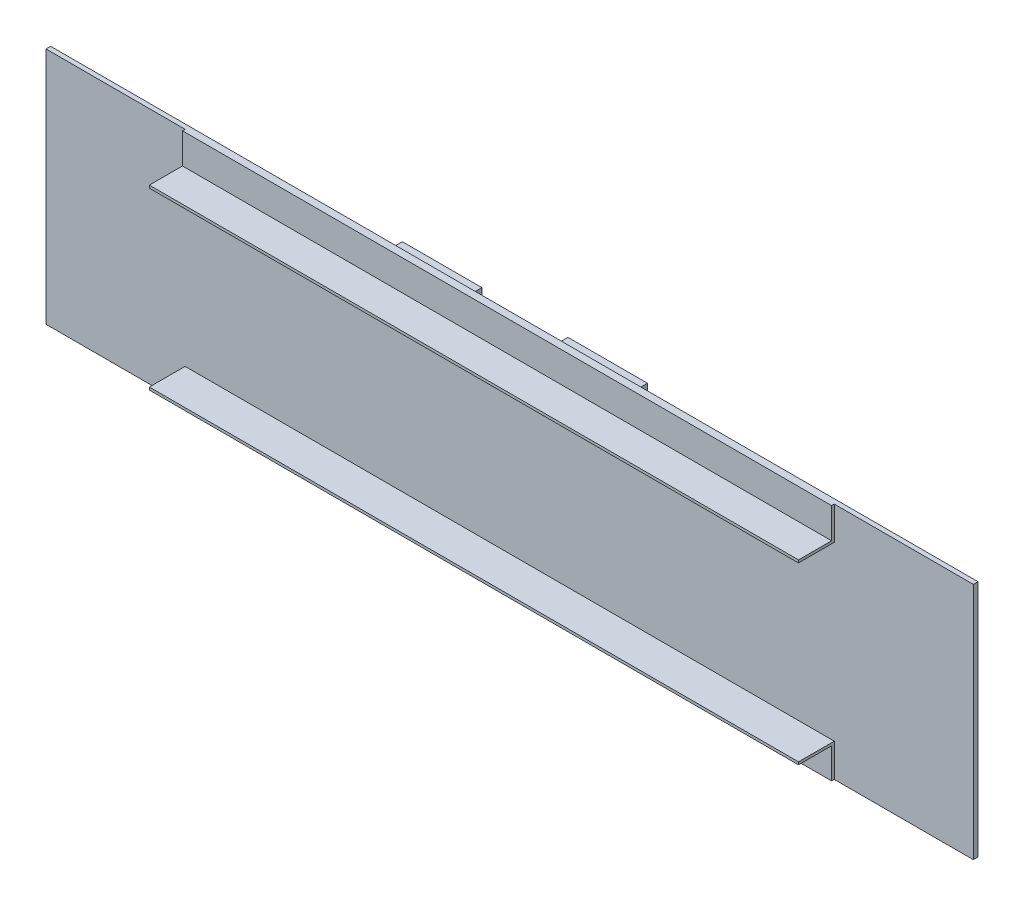
ISO-10303-21;
HEADER;
FILE_DESCRIPTION(('STEP AP214'),'2;1');
FILE_NAME('part.step','',(''),(''),'','','');
FILE_SCHEMA(('AUTOMOTIVE_DESIGN { 1 0 10303 214 1 1 1 1 }'));
ENDSEC;
DATA;
#1=APPLICATION_CONTEXT('core data for automotive mechanical design processes');
#2=APPLICATION_PROTOCOL_DEFINITION('international standard','automotive_design',2000,#1);
#3=PRODUCT_CONTEXT('',#1,'mechanical');
#4=PRODUCT('Part','Part','',(#3));
#5=PRODUCT_RELATED_PRODUCT_CATEGORY('part','',(#4));
#6=PRODUCT_DEFINITION_FORMATION('','',#4);
#7=PRODUCT_DEFINITION_CONTEXT('part definition',#1,'design');
#8=PRODUCT_DEFINITION('design','',#6,#7);
#9=PRODUCT_DEFINITION_SHAPE('','',#8);
#10=(LENGTH_UNIT() NAMED_UNIT(*) SI_UNIT(.MILLI.,.METRE.));
#11=(NAMED_UNIT(*) PLANE_ANGLE_UNIT() SI_UNIT($,.RADIAN.));
#12=(NAMED_UNIT(*) SI_UNIT($,.STERADIAN.) SOLID_ANGLE_UNIT());
#13=UNCERTAINTY_MEASURE_WITH_UNIT(LENGTH_MEASURE(1.E-05),#10,'distance_accuracy_value','');
#14=(GEOMETRIC_REPRESENTATION_CONTEXT(3) GLOBAL_UNCERTAINTY_ASSIGNED_CONTEXT((#13)) GLOBAL_UNIT_ASSIGNED_CONTEXT((#10,
#11,#12)) REPRESENTATION_CONTEXT('',''));
#15=CARTESIAN_POINT('',(0.,0.,0.));
#16=DIRECTION('',(0.,0.,1.));
#17=DIRECTION('',(1.,0.,0.));
#18=AXIS2_PLACEMENT_3D('',#15,#16,#17);
#19=CARTESIAN_POINT('',(-980.000000000001,260.,22.));
#20=DIRECTION('',(0.,0.,1.));
#21=DIRECTION('',(1.,0.,0.));
#22=AXIS2_PLACEMENT_3D('',#19,#20,#21);
#23=PLANE('',#22);
#24=DIRECTION('',(0.,-1.,0.));
#25=VECTOR('',#24,1.);
#26=CARTESIAN_POINT('',(-980.000000000001,360.,22.));
#27=LINE('',#26,#25);
#28=CARTESIAN_POINT('',(-980.000000000001,360.,22.));
#29=VERTEX_POINT('',#28);
#30=CARTESIAN_POINT('',(-980.000000000001,268.,22.));
#31=VERTEX_POINT('',#30);
#32=EDGE_CURVE('E447',#29,#31,#27,.T.);
#33=ORIENTED_EDGE('',*,*,#32,.T.);
#34=DIRECTION('',(-1.,0.,0.));
#35=VECTOR('',#34,1.);
#36=CARTESIAN_POINT('',(-980.000000000001,268.,22.));
#37=LINE('',#36,#35);
#38=CARTESIAN_POINT('',(980.000000000001,268.,22.));
#39=VERTEX_POINT('',#38);
#40=EDGE_CURVE('E453',#39,#31,#37,.T.);
#41=ORIENTED_EDGE('',*,*,#40,.F.);
#42=DIRECTION('',(0.,-1.,0.));
#43=VECTOR('',#42,1.);
#44=CARTESIAN_POINT('',(980.000000000001,360.,22.));
#45=LINE('',#44,#43);
#46=CARTESIAN_POINT('',(980.000000000001,360.,22.));
#47=VERTEX_POINT('',#46);
#48=EDGE_CURVE('E385',#47,#39,#45,.T.);
#49=ORIENTED_EDGE('',*,*,#48,.F.);
#50=DIRECTION('',(-1.,0.,0.));
#51=VECTOR('',#50,1.);
#52=CARTESIAN_POINT('',(-980.000000000001,360.,22.));
#53=LINE('',#52,#51);
#54=EDGE_CURVE('E451',#47,#29,#53,.T.);
#55=ORIENTED_EDGE('',*,*,#54,.T.);
#56=EDGE_LOOP('',(#33,#41,#49,#55));
#57=FACE_BOUND('',#56,.T.);
#58=ADVANCED_FACE('F36',(#57),#23,.T.);
#59=CARTESIAN_POINT('',(370.000000000001,348.,-32.));
#60=DIRECTION('',(0.,0.,-1.));
#61=DIRECTION('',(1.,0.,0.));
#62=AXIS2_PLACEMENT_3D('',#59,#60,#61);
#63=PLANE('',#62);
#64=DIRECTION('',(0.,-1.,0.));
#65=VECTOR('',#64,1.);
#66=CARTESIAN_POINT('',(370.000000000001,268.,-32.));
#67=LINE('',#66,#65);
#68=CARTESIAN_POINT('',(370.000000000001,348.,-32.));
#69=VERTEX_POINT('',#68);
#70=CARTESIAN_POINT('',(370.000000000001,268.,-32.));
#71=VERTEX_POINT('',#70);
#72=EDGE_CURVE('E247',#69,#71,#67,.T.);
#73=ORIENTED_EDGE('',*,*,#72,.T.);
#74=DIRECTION('',(-1.,0.,0.));
#75=VECTOR('',#74,1.);
#76=CARTESIAN_POINT('',(370.000000000001,268.,-32.));
#77=LINE('',#76,#75);
#78=CARTESIAN_POINT('',(130.000000000001,268.,-32.));
#79=VERTEX_POINT('',#78);
#80=EDGE_CURVE('E262',#71,#79,#77,.T.);
#81=ORIENTED_EDGE('',*,*,#80,.T.);
#82=DIRECTION('',(0.,1.,0.));
#83=VECTOR('',#82,1.);
#84=CARTESIAN_POINT('',(130.000000000001,268.,-32.));
#85=LINE('',#84,#83);
#86=CARTESIAN_POINT('',(130.000000000001,348.,-32.));
#87=VERTEX_POINT('',#86);
#88=EDGE_CURVE('E250',#79,#87,#85,.T.);
#89=ORIENTED_EDGE('',*,*,#88,.T.);
#90=DIRECTION('',(1.,0.,0.));
#91=VECTOR('',#90,1.);
#92=CARTESIAN_POINT('',(370.000000000001,348.,-32.));
#93=LINE('',#92,#91);
#94=EDGE_CURVE('E243',#87,#69,#93,.T.);
#95=ORIENTED_EDGE('',*,*,#94,.T.);
#96=EDGE_LOOP('',(#73,#81,#89,#95));
#97=FACE_BOUND('',#96,.T.);
#98=ADVANCED_FACE('F245',(#97),#63,.T.);
#99=CARTESIAN_POINT('',(1400.,-360.,0.));
#100=DIRECTION('',(0.,0.,1.));
#101=DIRECTION('',(1.,0.,0.));
#102=AXIS2_PLACEMENT_3D('',#99,#100,#101);
#103=PLANE('',#102);
#104=DIRECTION('',(0.,1.,0.));
#105=VECTOR('',#104,1.);
#106=CARTESIAN_POINT('',(-370.000000000001,-360.,0.));
#107=LINE('',#106,#105);
#108=CARTESIAN_POINT('',(-370.000000000001,-348.,0.));
#109=VERTEX_POINT('',#108);
#110=CARTESIAN_POINT('',(-370.000000000001,-268.,0.));
#111=VERTEX_POINT('',#110);
#112=EDGE_CURVE('E334',#109,#111,#107,.T.);
#113=ORIENTED_EDGE('',*,*,#112,.F.);
#114=DIRECTION('',(-1.,0.,0.));
#115=VECTOR('',#114,1.);
#116=CARTESIAN_POINT('',(1400.,-348.,0.));
#117=LINE('',#116,#115);
#118=CARTESIAN_POINT('',(-130.000000000001,-348.,0.));
#119=VERTEX_POINT('',#118);
#120=EDGE_CURVE('E337',#119,#109,#117,.T.);
#121=ORIENTED_EDGE('',*,*,#120,.F.);
#122=DIRECTION('',(0.,-1.,0.));
#123=VECTOR('',#122,1.);
#124=CARTESIAN_POINT('',(-130.000000000001,-360.,0.));
#125=LINE('',#124,#123);
#126=CARTESIAN_POINT('',(-130.000000000001,-268.,0.));
#127=VERTEX_POINT('',#126);
#128=EDGE_CURVE('E323',#127,#119,#125,.T.);
#129=ORIENTED_EDGE('',*,*,#128,.F.);
#130=DIRECTION('',(1.,0.,0.));
#131=VECTOR('',#130,1.);
#132=CARTESIAN_POINT('',(1400.,-268.,0.));
#133=LINE('',#132,#131);
#134=EDGE_CURVE('E340',#111,#127,#133,.T.);
#135=ORIENTED_EDGE('',*,*,#134,.F.);
#136=EDGE_LOOP('',(#113,#121,#129,#135));
#137=FACE_BOUND('',#136,.T.);
#138=DIRECTION('',(-1.,0.,0.));
#139=VECTOR('',#138,1.);
#140=CARTESIAN_POINT('',(1400.,348.,0.));
#141=LINE('',#140,#139);
#142=CARTESIAN_POINT('',(-130.000000000001,348.,0.));
#143=VERTEX_POINT('',#142);
#144=CARTESIAN_POINT('',(-370.000000000001,348.,0.));
#145=VERTEX_POINT('',#144);
#146=EDGE_CURVE('E375',#143,#145,#141,.T.);
#147=ORIENTED_EDGE('',*,*,#146,.T.);
#148=DIRECTION('',(0.,-1.,0.));
#149=VECTOR('',#148,1.);
#150=CARTESIAN_POINT('',(-370.000000000001,-360.,0.));
#151=LINE('',#150,#149);
#152=CARTESIAN_POINT('',(-370.000000000001,268.,0.));
#153=VERTEX_POINT('',#152);
#154=EDGE_CURVE('E369',#145,#153,#151,.T.);
#155=ORIENTED_EDGE('',*,*,#154,.T.);
#156=DIRECTION('',(1.,0.,0.));
#157=VECTOR('',#156,1.);
#158=CARTESIAN_POINT('',(1400.,268.,0.));
#159=LINE('',#158,#157);
#160=CARTESIAN_POINT('',(-130.000000000001,268.,0.));
#161=VERTEX_POINT('',#160);
#162=EDGE_CURVE('E372',#153,#161,#159,.T.);
#163=ORIENTED_EDGE('',*,*,#162,.T.);
#164=DIRECTION('',(0.,1.,0.));
#165=VECTOR('',#164,1.);
#166=CARTESIAN_POINT('',(-130.000000000001,-360.,0.));
#167=LINE('',#166,#165);
#168=EDGE_CURVE('E359',#161,#143,#167,.T.);
#169=ORIENTED_EDGE('',*,*,#168,.T.);
#170=EDGE_LOOP('',(#147,#155,#163,#169));
#171=FACE_BOUND('',#170,.T.);
#172=DIRECTION('',(0.,1.,0.));
#173=VECTOR('',#172,1.);
#174=CARTESIAN_POINT('',(1400.,360.,0.));
#175=LINE('',#174,#173);
#176=CARTESIAN_POINT('',(1400.,-360.,0.));
#177=VERTEX_POINT('',#176);
#178=CARTESIAN_POINT('',(1400.,360.,0.));
#179=VERTEX_POINT('',#178);
#180=EDGE_CURVE('E472',#177,#179,#175,.T.);
#181=ORIENTED_EDGE('',*,*,#180,.F.);
#182=DIRECTION('',(1.,0.,0.));
#183=VECTOR('',#182,1.);
#184=CARTESIAN_POINT('',(-1400.,-360.,0.));
#185=LINE('',#184,#183);
#186=CARTESIAN_POINT('',(-1400.,-360.,0.));
#187=VERTEX_POINT('',#186);
#188=EDGE_CURVE('E477',#187,#177,#185,.T.);
#189=ORIENTED_EDGE('',*,*,#188,.F.);
#190=DIRECTION('',(0.,-1.,0.));
#191=VECTOR('',#190,1.);
#192=CARTESIAN_POINT('',(-1400.,360.,0.));
#193=LINE('',#192,#191);
#194=CARTESIAN_POINT('',(-1400.,360.,0.));
#195=VERTEX_POINT('',#194);
#196=EDGE_CURVE('E490',#195,#187,#193,.T.);
#197=ORIENTED_EDGE('',*,*,#196,.F.);
#198=DIRECTION('',(-1.,0.,0.));
#199=VECTOR('',#198,1.);
#200=CARTESIAN_POINT('',(-1400.,360.,0.));
#201=LINE('',#200,#199);
#202=EDGE_CURVE('E488',#179,#195,#201,.T.);
#203=ORIENTED_EDGE('',*,*,#202,.F.);
#204=EDGE_LOOP('',(#181,#189,#197,#203));
#205=FACE_BOUND('',#204,.T.);
#206=DIRECTION('',(1.,0.,0.));
#207=VECTOR('',#206,1.);
#208=CARTESIAN_POINT('',(1400.,-348.,0.));
#209=LINE('',#208,#207);
#210=CARTESIAN_POINT('',(130.000000000001,-348.,0.));
#211=VERTEX_POINT('',#210);
#212=CARTESIAN_POINT('',(370.000000000001,-348.,0.));
#213=VERTEX_POINT('',#212);
#214=EDGE_CURVE('E11',#211,#213,#209,.T.);
#215=ORIENTED_EDGE('',*,*,#214,.T.);
#216=DIRECTION('',(0.,1.,0.));
#217=VECTOR('',#216,1.);
#218=CARTESIAN_POINT('',(370.000000000001,-360.,0.));
#219=LINE('',#218,#217);
#220=CARTESIAN_POINT('',(370.000000000001,-268.,0.));
#221=VERTEX_POINT('',#220);
#222=EDGE_CURVE('E307',#213,#221,#219,.T.);
#223=ORIENTED_EDGE('',*,*,#222,.T.);
#224=DIRECTION('',(-1.,0.,0.));
#225=VECTOR('',#224,1.);
#226=CARTESIAN_POINT('',(1400.,-268.,0.));
#227=LINE('',#226,#225);
#228=CARTESIAN_POINT('',(130.000000000001,-268.,0.));
#229=VERTEX_POINT('',#228);
#230=EDGE_CURVE('E44',#221,#229,#227,.T.);
#231=ORIENTED_EDGE('',*,*,#230,.T.);
#232=DIRECTION('',(0.,-1.,0.));
#233=VECTOR('',#232,1.);
#234=CARTESIAN_POINT('',(130.000000000001,-360.,0.));
#235=LINE('',#234,#233);
#236=EDGE_CURVE('E297',#229,#211,#235,.T.);
#237=ORIENTED_EDGE('',*,*,#236,.T.);
#238=EDGE_LOOP('',(#215,#223,#231,#237));
#239=FACE_BOUND('',#238,.T.);
#240=DIRECTION('',(0.,-1.,0.));
#241=VECTOR('',#240,1.);
#242=CARTESIAN_POINT('',(370.000000000001,-360.,0.));
#243=LINE('',#242,#241);
#244=CARTESIAN_POINT('',(370.000000000001,348.,0.));
#245=VERTEX_POINT('',#244);
#246=CARTESIAN_POINT('',(370.000000000001,268.,0.));
#247=VERTEX_POINT('',#246);
#248=EDGE_CURVE('E277',#245,#247,#243,.T.);
#249=ORIENTED_EDGE('',*,*,#248,.F.);
#250=DIRECTION('',(1.,0.,0.));
#251=VECTOR('',#250,1.);
#252=CARTESIAN_POINT('',(1400.,348.,0.));
#253=LINE('',#252,#251);
#254=CARTESIAN_POINT('',(130.000000000001,348.,0.));
#255=VERTEX_POINT('',#254);
#256=EDGE_CURVE('E259',#255,#245,#253,.T.);
#257=ORIENTED_EDGE('',*,*,#256,.F.);
#258=DIRECTION('',(0.,1.,0.));
#259=VECTOR('',#258,1.);
#260=CARTESIAN_POINT('',(130.000000000001,-360.,0.));
#261=LINE('',#260,#259);
#262=CARTESIAN_POINT('',(130.000000000001,268.,0.));
#263=VERTEX_POINT('',#262);
#264=EDGE_CURVE('E56',#263,#255,#261,.T.);
#265=ORIENTED_EDGE('',*,*,#264,.F.);
#266=DIRECTION('',(-1.,0.,0.));
#267=VECTOR('',#266,1.);
#268=CARTESIAN_POINT('',(1400.,268.,0.));
#269=LINE('',#268,#267);
#270=EDGE_CURVE('E51',#247,#263,#269,.T.);
#271=ORIENTED_EDGE('',*,*,#270,.F.);
#272=EDGE_LOOP('',(#249,#257,#265,#271));
#273=FACE_BOUND('',#272,.T.);
#274=ADVANCED_FACE('F508',(#137,#171,#205,#239,#273),#103,.F.);
#275=CARTESIAN_POINT('',(-980.000000000001,-260.,22.));
#276=DIRECTION('',(0.,0.,1.));
#277=DIRECTION('',(1.,0.,0.));
#278=AXIS2_PLACEMENT_3D('',#275,#276,#277);
#279=PLANE('',#278);
#280=DIRECTION('',(-1.,0.,0.));
#281=VECTOR('',#280,1.);
#282=CARTESIAN_POINT('',(-980.000000000001,-268.,22.));
#283=LINE('',#282,#281);
#284=CARTESIAN_POINT('',(980.000000000001,-268.,22.));
#285=VERTEX_POINT('',#284);
#286=CARTESIAN_POINT('',(-980.000000000001,-268.,22.));
#287=VERTEX_POINT('',#286);
#288=EDGE_CURVE('E410',#285,#287,#283,.T.);
#289=ORIENTED_EDGE('',*,*,#288,.T.);
#290=DIRECTION('',(0.,1.,0.));
#291=VECTOR('',#290,1.);
#292=CARTESIAN_POINT('',(-980.000000000001,-360.,22.));
#293=LINE('',#292,#291);
#294=CARTESIAN_POINT('',(-980.000000000001,-360.,22.));
#295=VERTEX_POINT('',#294);
#296=EDGE_CURVE('E427',#295,#287,#293,.T.);
#297=ORIENTED_EDGE('',*,*,#296,.F.);
#298=DIRECTION('',(-1.,0.,0.));
#299=VECTOR('',#298,1.);
#300=CARTESIAN_POINT('',(-980.000000000001,-360.,22.));
#301=LINE('',#300,#299);
#302=CARTESIAN_POINT('',(980.000000000001,-360.,22.));
#303=VERTEX_POINT('',#302);
#304=EDGE_CURVE('E529',#303,#295,#301,.T.);
#305=ORIENTED_EDGE('',*,*,#304,.F.);
#306=DIRECTION('',(0.,1.,0.));
#307=VECTOR('',#306,1.);
#308=CARTESIAN_POINT('',(980.000000000001,-360.,22.));
#309=LINE('',#308,#307);
#310=EDGE_CURVE('E401',#303,#285,#309,.T.);
#311=ORIENTED_EDGE('',*,*,#310,.T.);
#312=EDGE_LOOP('',(#289,#297,#305,#311));
#313=FACE_BOUND('',#312,.T.);
#314=ADVANCED_FACE('F527',(#313),#279,.T.);
#315=CARTESIAN_POINT('',(-370.000000000001,-348.,-32.));
#316=DIRECTION('',(0.,0.,-1.));
#317=DIRECTION('',(-1.,0.,0.));
#318=AXIS2_PLACEMENT_3D('',#315,#316,#317);
#319=PLANE('',#318);
#320=DIRECTION('',(0.,1.,0.));
#321=VECTOR('',#320,1.);
#322=CARTESIAN_POINT('',(-370.000000000001,-268.,-32.));
#323=LINE('',#322,#321);
#324=CARTESIAN_POINT('',(-370.000000000001,-348.,-32.));
#325=VERTEX_POINT('',#324);
#326=CARTESIAN_POINT('',(-370.000000000001,-268.,-32.));
#327=VERTEX_POINT('',#326);
#328=EDGE_CURVE('E310',#325,#327,#323,.T.);
#329=ORIENTED_EDGE('',*,*,#328,.T.);
#330=DIRECTION('',(1.,0.,0.));
#331=VECTOR('',#330,1.);
#332=CARTESIAN_POINT('',(-370.000000000001,-268.,-32.));
#333=LINE('',#332,#331);
#334=CARTESIAN_POINT('',(-130.000000000001,-268.,-32.));
#335=VERTEX_POINT('',#334);
#336=EDGE_CURVE('E317',#327,#335,#333,.T.);
#337=ORIENTED_EDGE('',*,*,#336,.T.);
#338=DIRECTION('',(0.,-1.,0.));
#339=VECTOR('',#338,1.);
#340=CARTESIAN_POINT('',(-130.000000000001,-268.,-32.));
#341=LINE('',#340,#339);
#342=CARTESIAN_POINT('',(-130.000000000001,-348.,-32.));
#343=VERTEX_POINT('',#342);
#344=EDGE_CURVE('E315',#335,#343,#341,.T.);
#345=ORIENTED_EDGE('',*,*,#344,.T.);
#346=DIRECTION('',(-1.,0.,0.));
#347=VECTOR('',#346,1.);
#348=CARTESIAN_POINT('',(-370.000000000001,-348.,-32.));
#349=LINE('',#348,#347);
#350=EDGE_CURVE('E313',#343,#325,#349,.T.);
#351=ORIENTED_EDGE('',*,*,#350,.T.);
#352=EDGE_LOOP('',(#329,#337,#345,#351));
#353=FACE_BOUND('',#352,.T.);
#354=ADVANCED_FACE('F593',(#353),#319,.T.);
#355=CARTESIAN_POINT('',(1400.,-360.,14.));
#356=DIRECTION('',(0.,0.,1.));
#357=DIRECTION('',(1.,0.,0.));
#358=AXIS2_PLACEMENT_3D('',#355,#356,#357);
#359=PLANE('',#358);
#360=DIRECTION('',(0.,-1.,0.));
#361=VECTOR('',#360,1.);
#362=CARTESIAN_POINT('',(980.000000000001,360.,14.));
#363=LINE('',#362,#361);
#364=CARTESIAN_POINT('',(980.000000000001,360.,14.));
#365=VERTEX_POINT('',#364);
#366=CARTESIAN_POINT('',(980.000000000001,260.,14.));
#367=VERTEX_POINT('',#366);
#368=EDGE_CURVE('E384',#365,#367,#363,.T.);
#369=ORIENTED_EDGE('',*,*,#368,.T.);
#370=DIRECTION('',(1.,0.,0.));
#371=VECTOR('',#370,1.);
#372=CARTESIAN_POINT('',(-980.000000000001,260.,14.));
#373=LINE('',#372,#371);
#374=CARTESIAN_POINT('',(-980.000000000001,260.,14.));
#375=VERTEX_POINT('',#374);
#376=EDGE_CURVE('E452',#375,#367,#373,.T.);
#377=ORIENTED_EDGE('',*,*,#376,.F.);
#378=DIRECTION('',(0.,-1.,0.));
#379=VECTOR('',#378,1.);
#380=CARTESIAN_POINT('',(-980.000000000001,360.,14.));
#381=LINE('',#380,#379);
#382=CARTESIAN_POINT('',(-980.000000000001,360.,14.));
#383=VERTEX_POINT('',#382);
#384=EDGE_CURVE('E462',#383,#375,#381,.T.);
#385=ORIENTED_EDGE('',*,*,#384,.F.);
#386=DIRECTION('',(-1.,0.,0.));
#387=VECTOR('',#386,1.);
#388=CARTESIAN_POINT('',(-1400.,360.,14.));
#389=LINE('',#388,#387);
#390=CARTESIAN_POINT('',(-1400.,360.,14.));
#391=VERTEX_POINT('',#390);
#392=EDGE_CURVE('E476',#383,#391,#389,.T.);
#393=ORIENTED_EDGE('',*,*,#392,.T.);
#394=DIRECTION('',(0.,-1.,0.));
#395=VECTOR('',#394,1.);
#396=CARTESIAN_POINT('',(-1400.,360.,14.));
#397=LINE('',#396,#395);
#398=CARTESIAN_POINT('',(-1400.,-360.,14.));
#399=VERTEX_POINT('',#398);
#400=EDGE_CURVE('E481',#391,#399,#397,.T.);
#401=ORIENTED_EDGE('',*,*,#400,.T.);
#402=DIRECTION('',(1.,0.,0.));
#403=VECTOR('',#402,1.);
#404=CARTESIAN_POINT('',(-1400.,-360.,14.));
#405=LINE('',#404,#403);
#406=CARTESIAN_POINT('',(-980.000000000001,-360.,14.));
#407=VERTEX_POINT('',#406);
#408=EDGE_CURVE('E484',#399,#407,#405,.T.);
#409=ORIENTED_EDGE('',*,*,#408,.T.);
#410=DIRECTION('',(0.,1.,0.));
#411=VECTOR('',#410,1.);
#412=CARTESIAN_POINT('',(-980.000000000001,-360.,14.));
#413=LINE('',#412,#411);
#414=CARTESIAN_POINT('',(-980.000000000001,-260.,14.));
#415=VERTEX_POINT('',#414);
#416=EDGE_CURVE('E431',#407,#415,#413,.T.);
#417=ORIENTED_EDGE('',*,*,#416,.T.);
#418=DIRECTION('',(1.,0.,0.));
#419=VECTOR('',#418,1.);
#420=CARTESIAN_POINT('',(-980.000000000001,-260.,14.));
#421=LINE('',#420,#419);
#422=CARTESIAN_POINT('',(980.000000000001,-260.,14.));
#423=VERTEX_POINT('',#422);
#424=EDGE_CURVE('E520',#415,#423,#421,.T.);
#425=ORIENTED_EDGE('',*,*,#424,.T.);
#426=DIRECTION('',(0.,1.,0.));
#427=VECTOR('',#426,1.);
#428=CARTESIAN_POINT('',(980.000000000001,-360.,14.));
#429=LINE('',#428,#427);
#430=CARTESIAN_POINT('',(980.000000000001,-360.,14.));
#431=VERTEX_POINT('',#430);
#432=EDGE_CURVE('E400',#431,#423,#429,.T.);
#433=ORIENTED_EDGE('',*,*,#432,.F.);
#434=CARTESIAN_POINT('',(1400.,-360.,14.));
#435=VERTEX_POINT('',#434);
#436=EDGE_CURVE('E483',#431,#435,#405,.T.);
#437=ORIENTED_EDGE('',*,*,#436,.T.);
#438=DIRECTION('',(0.,1.,0.));
#439=VECTOR('',#438,1.);
#440=CARTESIAN_POINT('',(1400.,360.,14.));
#441=LINE('',#440,#439);
#442=CARTESIAN_POINT('',(1400.,360.,14.));
#443=VERTEX_POINT('',#442);
#444=EDGE_CURVE('E473',#435,#443,#441,.T.);
#445=ORIENTED_EDGE('',*,*,#444,.T.);
#446=EDGE_CURVE('E478',#443,#365,#389,.T.);
#447=ORIENTED_EDGE('',*,*,#446,.T.);
#448=EDGE_LOOP('',(#369,#377,#385,#393,#401,#409,#417,#425,#433,#437,#445,#447));
#449=FACE_BOUND('',#448,.T.);
#450=ADVANCED_FACE('F516',(#449),#359,.T.);
#451=CARTESIAN_POINT('',(1400.,360.,14.));
#452=DIRECTION('',(-1.,0.,0.));
#453=DIRECTION('',(0.,0.,1.));
#454=AXIS2_PLACEMENT_3D('',#451,#452,#453);
#455=PLANE('',#454);
#456=ORIENTED_EDGE('',*,*,#180,.T.);
#457=DIRECTION('',(0.,0.,-1.));
#458=VECTOR('',#457,1.);
#459=CARTESIAN_POINT('',(1400.,360.,14.));
#460=LINE('',#459,#458);
#461=EDGE_CURVE('E434',#443,#179,#460,.T.);
#462=ORIENTED_EDGE('',*,*,#461,.F.);
#463=ORIENTED_EDGE('',*,*,#444,.F.);
#464=DIRECTION('',(0.,0.,-1.));
#465=VECTOR('',#464,1.);
#466=CARTESIAN_POINT('',(1400.,-360.,14.));
#467=LINE('',#466,#465);
#468=EDGE_CURVE('E486',#435,#177,#467,.T.);
#469=ORIENTED_EDGE('',*,*,#468,.T.);
#470=EDGE_LOOP('',(#456,#462,#463,#469));
#471=FACE_BOUND('',#470,.T.);
#472=ADVANCED_FACE('F38',(#471),#455,.F.);
#473=CARTESIAN_POINT('',(-1400.,360.,14.));
#474=DIRECTION('',(0.,-1.,0.));
#475=DIRECTION('',(0.,0.,-1.));
#476=AXIS2_PLACEMENT_3D('',#473,#474,#475);
#477=PLANE('',#476);
#478=DIRECTION('',(0.,0.,-1.));
#479=VECTOR('',#478,1.);
#480=CARTESIAN_POINT('',(980.000000000001,360.,22.));
#481=LINE('',#480,#479);
#482=EDGE_CURVE('E392',#47,#365,#481,.T.);
#483=ORIENTED_EDGE('',*,*,#482,.T.);
#484=ORIENTED_EDGE('',*,*,#446,.F.);
#485=ORIENTED_EDGE('',*,*,#461,.T.);
#486=ORIENTED_EDGE('',*,*,#202,.T.);
#487=DIRECTION('',(0.,0.,-1.));
#488=VECTOR('',#487,1.);
#489=CARTESIAN_POINT('',(-1400.,360.,14.));
#490=LINE('',#489,#488);
#491=EDGE_CURVE('E437',#391,#195,#490,.T.);
#492=ORIENTED_EDGE('',*,*,#491,.F.);
#493=ORIENTED_EDGE('',*,*,#392,.F.);
#494=DIRECTION('',(0.,0.,-1.));
#495=VECTOR('',#494,1.);
#496=CARTESIAN_POINT('',(-980.000000000001,360.,22.));
#497=LINE('',#496,#495);
#498=EDGE_CURVE('E461',#29,#383,#497,.T.);
#499=ORIENTED_EDGE('',*,*,#498,.F.);
#500=ORIENTED_EDGE('',*,*,#54,.F.);
#501=EDGE_LOOP('',(#483,#484,#485,#486,#492,#493,#499,#500));
#502=FACE_BOUND('',#501,.T.);
#503=ADVANCED_FACE('F559',(#502),#477,.F.);
#504=CARTESIAN_POINT('',(-1400.,360.,14.));
#505=DIRECTION('',(1.,0.,0.));
#506=DIRECTION('',(0.,0.,-1.));
#507=AXIS2_PLACEMENT_3D('',#504,#505,#506);
#508=PLANE('',#507);
#509=ORIENTED_EDGE('',*,*,#196,.T.);
#510=DIRECTION('',(0.,0.,-1.));
#511=VECTOR('',#510,1.);
#512=CARTESIAN_POINT('',(-1400.,-360.,14.));
#513=LINE('',#512,#511);
#514=EDGE_CURVE('E443',#399,#187,#513,.T.);
#515=ORIENTED_EDGE('',*,*,#514,.F.);
#516=ORIENTED_EDGE('',*,*,#400,.F.);
#517=ORIENTED_EDGE('',*,*,#491,.T.);
#518=EDGE_LOOP('',(#509,#515,#516,#517));
#519=FACE_BOUND('',#518,.T.);
#520=ADVANCED_FACE('F599',(#519),#508,.F.);
#521=CARTESIAN_POINT('',(-1400.,-360.,14.));
#522=DIRECTION('',(0.,1.,0.));
#523=DIRECTION('',(0.,0.,1.));
#524=AXIS2_PLACEMENT_3D('',#521,#522,#523);
#525=PLANE('',#524);
#526=ORIENTED_EDGE('',*,*,#436,.F.);
#527=DIRECTION('',(0.,0.,-1.));
#528=VECTOR('',#527,1.);
#529=CARTESIAN_POINT('',(980.000000000001,-360.,22.));
#530=LINE('',#529,#528);
#531=EDGE_CURVE('E404',#303,#431,#530,.T.);
#532=ORIENTED_EDGE('',*,*,#531,.F.);
#533=ORIENTED_EDGE('',*,*,#304,.T.);
#534=DIRECTION('',(0.,0.,-1.));
#535=VECTOR('',#534,1.);
#536=CARTESIAN_POINT('',(-980.000000000001,-360.,22.));
#537=LINE('',#536,#535);
#538=EDGE_CURVE('E532',#295,#407,#537,.T.);
#539=ORIENTED_EDGE('',*,*,#538,.T.);
#540=ORIENTED_EDGE('',*,*,#408,.F.);
#541=ORIENTED_EDGE('',*,*,#514,.T.);
#542=ORIENTED_EDGE('',*,*,#188,.T.);
#543=ORIENTED_EDGE('',*,*,#468,.F.);
#544=EDGE_LOOP('',(#526,#532,#533,#539,#540,#541,#542,#543));
#545=FACE_BOUND('',#544,.T.);
#546=ADVANCED_FACE('F500',(#545),#525,.F.);
#547=CARTESIAN_POINT('',(-980.000000000001,360.,22.));
#548=DIRECTION('',(1.,0.,0.));
#549=DIRECTION('',(0.,0.,-1.));
#550=AXIS2_PLACEMENT_3D('',#547,#548,#549);
#551=PLANE('',#550);
#552=DIRECTION('',(0.,0.,-1.));
#553=VECTOR('',#552,1.);
#554=CARTESIAN_POINT('',(-980.000000000001,268.,122.));
#555=LINE('',#554,#553);
#556=CARTESIAN_POINT('',(-980.000000000001,268.,122.));
#557=VERTEX_POINT('',#556);
#558=EDGE_CURVE('E465',#557,#31,#555,.T.);
#559=ORIENTED_EDGE('',*,*,#558,.T.);
#560=ORIENTED_EDGE('',*,*,#32,.F.);
#561=ORIENTED_EDGE('',*,*,#498,.T.);
#562=ORIENTED_EDGE('',*,*,#384,.T.);
#563=DIRECTION('',(0.,0.,-1.));
#564=VECTOR('',#563,1.);
#565=CARTESIAN_POINT('',(-980.000000000001,260.,22.));
#566=LINE('',#565,#564);
#567=CARTESIAN_POINT('',(-980.000000000001,260.,122.));
#568=VERTEX_POINT('',#567);
#569=EDGE_CURVE('E470',#568,#375,#566,.T.);
#570=ORIENTED_EDGE('',*,*,#569,.F.);
#571=DIRECTION('',(0.,-1.,0.));
#572=VECTOR('',#571,1.);
#573=CARTESIAN_POINT('',(-980.000000000001,260.,122.));
#574=LINE('',#573,#572);
#575=EDGE_CURVE('E538',#557,#568,#574,.T.);
#576=ORIENTED_EDGE('',*,*,#575,.F.);
#577=EDGE_LOOP('',(#559,#560,#561,#562,#570,#576));
#578=FACE_BOUND('',#577,.T.);
#579=ADVANCED_FACE('F551',(#578),#551,.F.);
#580=CARTESIAN_POINT('',(-980.000000000001,260.,22.));
#581=DIRECTION('',(0.,1.,0.));
#582=DIRECTION('',(0.,0.,1.));
#583=AXIS2_PLACEMENT_3D('',#580,#581,#582);
#584=PLANE('',#583);
#585=ORIENTED_EDGE('',*,*,#569,.T.);
#586=ORIENTED_EDGE('',*,*,#376,.T.);
#587=DIRECTION('',(0.,0.,-1.));
#588=VECTOR('',#587,1.);
#589=CARTESIAN_POINT('',(980.000000000001,260.,22.));
#590=LINE('',#589,#588);
#591=CARTESIAN_POINT('',(980.000000000001,260.,122.));
#592=VERTEX_POINT('',#591);
#593=EDGE_CURVE('E388',#592,#367,#590,.T.);
#594=ORIENTED_EDGE('',*,*,#593,.F.);
#595=DIRECTION('',(1.,0.,0.));
#596=VECTOR('',#595,1.);
#597=CARTESIAN_POINT('',(-980.000000000001,260.,122.));
#598=LINE('',#597,#596);
#599=EDGE_CURVE('E541',#568,#592,#598,.T.);
#600=ORIENTED_EDGE('',*,*,#599,.F.);
#601=EDGE_LOOP('',(#585,#586,#594,#600));
#602=FACE_BOUND('',#601,.T.);
#603=ADVANCED_FACE('F567',(#602),#584,.F.);
#604=CARTESIAN_POINT('',(-980.000000000001,268.,122.));
#605=DIRECTION('',(0.,-1.,0.));
#606=DIRECTION('',(0.,0.,-1.));
#607=AXIS2_PLACEMENT_3D('',#604,#605,#606);
#608=PLANE('',#607);
#609=ORIENTED_EDGE('',*,*,#40,.T.);
#610=ORIENTED_EDGE('',*,*,#558,.F.);
#611=DIRECTION('',(-1.,0.,0.));
#612=VECTOR('',#611,1.);
#613=CARTESIAN_POINT('',(-980.000000000001,268.,122.));
#614=LINE('',#613,#612);
#615=CARTESIAN_POINT('',(980.000000000001,268.,122.));
#616=VERTEX_POINT('',#615);
#617=EDGE_CURVE('E542',#616,#557,#614,.T.);
#618=ORIENTED_EDGE('',*,*,#617,.F.);
#619=DIRECTION('',(0.,0.,-1.));
#620=VECTOR('',#619,1.);
#621=CARTESIAN_POINT('',(980.000000000001,268.,122.));
#622=LINE('',#621,#620);
#623=EDGE_CURVE('E381',#616,#39,#622,.T.);
#624=ORIENTED_EDGE('',*,*,#623,.T.);
#625=EDGE_LOOP('',(#609,#610,#618,#624));
#626=FACE_BOUND('',#625,.T.);
#627=ADVANCED_FACE('F553',(#626),#608,.F.);
#628=CARTESIAN_POINT('',(-980.000000000001,268.,122.));
#629=DIRECTION('',(0.,0.,-1.));
#630=DIRECTION('',(-1.,0.,0.));
#631=AXIS2_PLACEMENT_3D('',#628,#629,#630);
#632=PLANE('',#631);
#633=ORIENTED_EDGE('',*,*,#575,.T.);
#634=ORIENTED_EDGE('',*,*,#599,.T.);
#635=DIRECTION('',(0.,-1.,0.));
#636=VECTOR('',#635,1.);
#637=CARTESIAN_POINT('',(980.000000000001,260.,122.));
#638=LINE('',#637,#636);
#639=EDGE_CURVE('E378',#616,#592,#638,.T.);
#640=ORIENTED_EDGE('',*,*,#639,.F.);
#641=ORIENTED_EDGE('',*,*,#617,.T.);
#642=EDGE_LOOP('',(#633,#634,#640,#641));
#643=FACE_BOUND('',#642,.T.);
#644=ADVANCED_FACE('F568',(#643),#632,.F.);
#645=CARTESIAN_POINT('',(-980.000000000001,-360.,22.));
#646=DIRECTION('',(-1.,0.,0.));
#647=DIRECTION('',(0.,0.,1.));
#648=AXIS2_PLACEMENT_3D('',#645,#646,#647);
#649=PLANE('',#648);
#650=ORIENTED_EDGE('',*,*,#296,.T.);
#651=DIRECTION('',(0.,0.,-1.));
#652=VECTOR('',#651,1.);
#653=CARTESIAN_POINT('',(-980.000000000001,-268.,122.));
#654=LINE('',#653,#652);
#655=CARTESIAN_POINT('',(-980.000000000001,-268.,122.));
#656=VERTEX_POINT('',#655);
#657=EDGE_CURVE('E419',#656,#287,#654,.T.);
#658=ORIENTED_EDGE('',*,*,#657,.F.);
#659=DIRECTION('',(0.,1.,0.));
#660=VECTOR('',#659,1.);
#661=CARTESIAN_POINT('',(-980.000000000001,-260.,122.));
#662=LINE('',#661,#660);
#663=CARTESIAN_POINT('',(-980.000000000001,-260.,122.));
#664=VERTEX_POINT('',#663);
#665=EDGE_CURVE('E411',#656,#664,#662,.T.);
#666=ORIENTED_EDGE('',*,*,#665,.T.);
#667=DIRECTION('',(0.,0.,-1.));
#668=VECTOR('',#667,1.);
#669=CARTESIAN_POINT('',(-980.000000000001,-260.,22.));
#670=LINE('',#669,#668);
#671=EDGE_CURVE('E531',#664,#415,#670,.T.);
#672=ORIENTED_EDGE('',*,*,#671,.T.);
#673=ORIENTED_EDGE('',*,*,#416,.F.);
#674=ORIENTED_EDGE('',*,*,#538,.F.);
#675=EDGE_LOOP('',(#650,#658,#666,#672,#673,#674));
#676=FACE_BOUND('',#675,.T.);
#677=ADVANCED_FACE('F570',(#676),#649,.T.);
#678=CARTESIAN_POINT('',(-980.000000000001,-260.,22.));
#679=DIRECTION('',(0.,1.,0.));
#680=DIRECTION('',(0.,0.,1.));
#681=AXIS2_PLACEMENT_3D('',#678,#679,#680);
#682=PLANE('',#681);
#683=ORIENTED_EDGE('',*,*,#424,.F.);
#684=ORIENTED_EDGE('',*,*,#671,.F.);
#685=DIRECTION('',(1.,0.,0.));
#686=VECTOR('',#685,1.);
#687=CARTESIAN_POINT('',(-980.000000000001,-260.,122.));
#688=LINE('',#687,#686);
#689=CARTESIAN_POINT('',(980.000000000001,-260.,122.));
#690=VERTEX_POINT('',#689);
#691=EDGE_CURVE('E417',#664,#690,#688,.T.);
#692=ORIENTED_EDGE('',*,*,#691,.T.);
#693=DIRECTION('',(0.,0.,-1.));
#694=VECTOR('',#693,1.);
#695=CARTESIAN_POINT('',(980.000000000001,-260.,22.));
#696=LINE('',#695,#694);
#697=EDGE_CURVE('E408',#690,#423,#696,.T.);
#698=ORIENTED_EDGE('',*,*,#697,.T.);
#699=EDGE_LOOP('',(#683,#684,#692,#698));
#700=FACE_BOUND('',#699,.T.);
#701=ADVANCED_FACE('F576',(#700),#682,.T.);
#702=CARTESIAN_POINT('',(-980.000000000001,-268.,122.));
#703=DIRECTION('',(0.,-1.,0.));
#704=DIRECTION('',(0.,0.,-1.));
#705=AXIS2_PLACEMENT_3D('',#702,#703,#704);
#706=PLANE('',#705);
#707=ORIENTED_EDGE('',*,*,#288,.F.);
#708=DIRECTION('',(0.,0.,-1.));
#709=VECTOR('',#708,1.);
#710=CARTESIAN_POINT('',(980.000000000001,-268.,122.));
#711=LINE('',#710,#709);
#712=CARTESIAN_POINT('',(980.000000000001,-268.,122.));
#713=VERTEX_POINT('',#712);
#714=EDGE_CURVE('E397',#713,#285,#711,.T.);
#715=ORIENTED_EDGE('',*,*,#714,.F.);
#716=DIRECTION('',(-1.,0.,0.));
#717=VECTOR('',#716,1.);
#718=CARTESIAN_POINT('',(-980.000000000001,-268.,122.));
#719=LINE('',#718,#717);
#720=EDGE_CURVE('E414',#713,#656,#719,.T.);
#721=ORIENTED_EDGE('',*,*,#720,.T.);
#722=ORIENTED_EDGE('',*,*,#657,.T.);
#723=EDGE_LOOP('',(#707,#715,#721,#722));
#724=FACE_BOUND('',#723,.T.);
#725=ADVANCED_FACE('F673',(#724),#706,.T.);
#726=CARTESIAN_POINT('',(-980.000000000001,-268.,122.));
#727=DIRECTION('',(0.,0.,-1.));
#728=DIRECTION('',(-1.,0.,0.));
#729=AXIS2_PLACEMENT_3D('',#726,#727,#728);
#730=PLANE('',#729);
#731=ORIENTED_EDGE('',*,*,#665,.F.);
#732=ORIENTED_EDGE('',*,*,#720,.F.);
#733=DIRECTION('',(0.,1.,0.));
#734=VECTOR('',#733,1.);
#735=CARTESIAN_POINT('',(980.000000000001,-260.,122.));
#736=LINE('',#735,#734);
#737=EDGE_CURVE('E394',#713,#690,#736,.T.);
#738=ORIENTED_EDGE('',*,*,#737,.T.);
#739=ORIENTED_EDGE('',*,*,#691,.F.);
#740=EDGE_LOOP('',(#731,#732,#738,#739));
#741=FACE_BOUND('',#740,.T.);
#742=ADVANCED_FACE('F661',(#741),#730,.F.);
#743=CARTESIAN_POINT('',(980.000000000001,-360.,22.));
#744=DIRECTION('',(-1.,0.,0.));
#745=DIRECTION('',(0.,0.,1.));
#746=AXIS2_PLACEMENT_3D('',#743,#744,#745);
#747=PLANE('',#746);
#748=ORIENTED_EDGE('',*,*,#432,.T.);
#749=ORIENTED_EDGE('',*,*,#697,.F.);
#750=ORIENTED_EDGE('',*,*,#737,.F.);
#751=ORIENTED_EDGE('',*,*,#714,.T.);
#752=ORIENTED_EDGE('',*,*,#310,.F.);
#753=ORIENTED_EDGE('',*,*,#531,.T.);
#754=EDGE_LOOP('',(#748,#749,#750,#751,#752,#753));
#755=FACE_BOUND('',#754,.T.);
#756=ADVANCED_FACE('F523',(#755),#747,.F.);
#757=CARTESIAN_POINT('',(980.000000000001,360.,22.));
#758=DIRECTION('',(1.,0.,0.));
#759=DIRECTION('',(0.,0.,-1.));
#760=AXIS2_PLACEMENT_3D('',#757,#758,#759);
#761=PLANE('',#760);
#762=ORIENTED_EDGE('',*,*,#593,.T.);
#763=ORIENTED_EDGE('',*,*,#368,.F.);
#764=ORIENTED_EDGE('',*,*,#482,.F.);
#765=ORIENTED_EDGE('',*,*,#48,.T.);
#766=ORIENTED_EDGE('',*,*,#623,.F.);
#767=ORIENTED_EDGE('',*,*,#639,.T.);
#768=EDGE_LOOP('',(#762,#763,#764,#765,#766,#767));
#769=FACE_BOUND('',#768,.T.);
#770=ADVANCED_FACE('F642',(#769),#761,.T.);
#771=CARTESIAN_POINT('',(-370.000000000001,348.,-10.));
#772=DIRECTION('',(0.,1.,0.));
#773=DIRECTION('',(0.,0.,1.));
#774=AXIS2_PLACEMENT_3D('',#771,#772,#773);
#775=PLANE('',#774);
#776=ORIENTED_EDGE('',*,*,#146,.F.);
#777=DIRECTION('',(0.,0.,1.));
#778=VECTOR('',#777,1.);
#779=CARTESIAN_POINT('',(-130.000000000001,348.,-10.));
#780=LINE('',#779,#778);
#781=CARTESIAN_POINT('',(-130.000000000001,348.,-32.));
#782=VERTEX_POINT('',#781);
#783=EDGE_CURVE('E360',#782,#143,#780,.T.);
#784=ORIENTED_EDGE('',*,*,#783,.F.);
#785=DIRECTION('',(-1.,0.,0.));
#786=VECTOR('',#785,1.);
#787=CARTESIAN_POINT('',(-370.000000000001,348.,-32.));
#788=LINE('',#787,#786);
#789=CARTESIAN_POINT('',(-370.000000000001,348.,-32.));
#790=VERTEX_POINT('',#789);
#791=EDGE_CURVE('E352',#782,#790,#788,.T.);
#792=ORIENTED_EDGE('',*,*,#791,.T.);
#793=DIRECTION('',(0.,0.,1.));
#794=VECTOR('',#793,1.);
#795=CARTESIAN_POINT('',(-370.000000000001,348.,-10.));
#796=LINE('',#795,#794);
#797=EDGE_CURVE('E356',#790,#145,#796,.T.);
#798=ORIENTED_EDGE('',*,*,#797,.T.);
#799=EDGE_LOOP('',(#776,#784,#792,#798));
#800=FACE_BOUND('',#799,.T.);
#801=ADVANCED_FACE('F647',(#800),#775,.T.);
#802=CARTESIAN_POINT('',(-370.000000000001,268.,-10.));
#803=DIRECTION('',(0.,-1.,0.));
#804=DIRECTION('',(1.,0.,0.));
#805=AXIS2_PLACEMENT_3D('',#802,#803,#804);
#806=PLANE('',#805);
#807=ORIENTED_EDGE('',*,*,#162,.F.);
#808=DIRECTION('',(0.,0.,1.));
#809=VECTOR('',#808,1.);
#810=CARTESIAN_POINT('',(-370.000000000001,268.,-10.));
#811=LINE('',#810,#809);
#812=CARTESIAN_POINT('',(-370.000000000001,268.,-32.));
#813=VERTEX_POINT('',#812);
#814=EDGE_CURVE('E355',#813,#153,#811,.T.);
#815=ORIENTED_EDGE('',*,*,#814,.F.);
#816=DIRECTION('',(1.,0.,0.));
#817=VECTOR('',#816,1.);
#818=CARTESIAN_POINT('',(-370.000000000001,268.,-32.));
#819=LINE('',#818,#817);
#820=CARTESIAN_POINT('',(-130.000000000001,268.,-32.));
#821=VERTEX_POINT('',#820);
#822=EDGE_CURVE('E346',#813,#821,#819,.T.);
#823=ORIENTED_EDGE('',*,*,#822,.T.);
#824=DIRECTION('',(0.,0.,1.));
#825=VECTOR('',#824,1.);
#826=CARTESIAN_POINT('',(-130.000000000001,268.,-10.));
#827=LINE('',#826,#825);
#828=EDGE_CURVE('E363',#821,#161,#827,.T.);
#829=ORIENTED_EDGE('',*,*,#828,.T.);
#830=EDGE_LOOP('',(#807,#815,#823,#829));
#831=FACE_BOUND('',#830,.T.);
#832=ADVANCED_FACE('F951',(#831),#806,.T.);
#833=CARTESIAN_POINT('',(-370.000000000001,268.,-10.));
#834=DIRECTION('',(-1.,0.,0.));
#835=DIRECTION('',(0.,0.,1.));
#836=AXIS2_PLACEMENT_3D('',#833,#834,#835);
#837=PLANE('',#836);
#838=ORIENTED_EDGE('',*,*,#154,.F.);
#839=ORIENTED_EDGE('',*,*,#797,.F.);
#840=DIRECTION('',(0.,-1.,0.));
#841=VECTOR('',#840,1.);
#842=CARTESIAN_POINT('',(-370.000000000001,268.,-32.));
#843=LINE('',#842,#841);
#844=EDGE_CURVE('E343',#790,#813,#843,.T.);
#845=ORIENTED_EDGE('',*,*,#844,.T.);
#846=ORIENTED_EDGE('',*,*,#814,.T.);
#847=EDGE_LOOP('',(#838,#839,#845,#846));
#848=FACE_BOUND('',#847,.T.);
#849=ADVANCED_FACE('F943',(#848),#837,.T.);
#850=CARTESIAN_POINT('',(-130.000000000001,268.,-10.));
#851=DIRECTION('',(1.,0.,0.));
#852=DIRECTION('',(0.,0.,-1.));
#853=AXIS2_PLACEMENT_3D('',#850,#851,#852);
#854=PLANE('',#853);
#855=ORIENTED_EDGE('',*,*,#168,.F.);
#856=ORIENTED_EDGE('',*,*,#828,.F.);
#857=DIRECTION('',(0.,1.,0.));
#858=VECTOR('',#857,1.);
#859=CARTESIAN_POINT('',(-130.000000000001,268.,-32.));
#860=LINE('',#859,#858);
#861=EDGE_CURVE('E349',#821,#782,#860,.T.);
#862=ORIENTED_EDGE('',*,*,#861,.T.);
#863=ORIENTED_EDGE('',*,*,#783,.T.);
#864=EDGE_LOOP('',(#855,#856,#862,#863));
#865=FACE_BOUND('',#864,.T.);
#866=ADVANCED_FACE('F937',(#865),#854,.T.);
#867=CARTESIAN_POINT('',(-370.000000000001,348.,-32.));
#868=DIRECTION('',(0.,0.,-1.));
#869=DIRECTION('',(-1.,0.,0.));
#870=AXIS2_PLACEMENT_3D('',#867,#868,#869);
#871=PLANE('',#870);
#872=ORIENTED_EDGE('',*,*,#844,.F.);
#873=ORIENTED_EDGE('',*,*,#791,.F.);
#874=ORIENTED_EDGE('',*,*,#861,.F.);
#875=ORIENTED_EDGE('',*,*,#822,.F.);
#876=EDGE_LOOP('',(#872,#873,#874,#875));
#877=FACE_BOUND('',#876,.T.);
#878=ADVANCED_FACE('F929',(#877),#871,.T.);
#879=CARTESIAN_POINT('',(-370.000000000001,-268.,-32.));
#880=DIRECTION('',(0.,-1.,0.));
#881=DIRECTION('',(1.,0.,0.));
#882=AXIS2_PLACEMENT_3D('',#879,#880,#881);
#883=PLANE('',#882);
#884=DIRECTION('',(0.,0.,1.));
#885=VECTOR('',#884,1.);
#886=CARTESIAN_POINT('',(-370.000000000001,-268.,-32.));
#887=LINE('',#886,#885);
#888=EDGE_CURVE('E320',#327,#111,#887,.T.);
#889=ORIENTED_EDGE('',*,*,#888,.T.);
#890=ORIENTED_EDGE('',*,*,#134,.T.);
#891=DIRECTION('',(0.,0.,1.));
#892=VECTOR('',#891,1.);
#893=CARTESIAN_POINT('',(-130.000000000001,-268.,-32.));
#894=LINE('',#893,#892);
#895=EDGE_CURVE('E324',#335,#127,#894,.T.);
#896=ORIENTED_EDGE('',*,*,#895,.F.);
#897=ORIENTED_EDGE('',*,*,#336,.F.);
#898=EDGE_LOOP('',(#889,#890,#896,#897));
#899=FACE_BOUND('',#898,.T.);
#900=ADVANCED_FACE('F921',(#899),#883,.F.);
#901=CARTESIAN_POINT('',(-370.000000000001,-348.,-32.));
#902=DIRECTION('',(0.,1.,0.));
#903=DIRECTION('',(0.,0.,1.));
#904=AXIS2_PLACEMENT_3D('',#901,#902,#903);
#905=PLANE('',#904);
#906=DIRECTION('',(0.,0.,1.));
#907=VECTOR('',#906,1.);
#908=CARTESIAN_POINT('',(-130.000000000001,-348.,-32.));
#909=LINE('',#908,#907);
#910=EDGE_CURVE('E327',#343,#119,#909,.T.);
#911=ORIENTED_EDGE('',*,*,#910,.T.);
#912=ORIENTED_EDGE('',*,*,#120,.T.);
#913=DIRECTION('',(0.,0.,1.));
#914=VECTOR('',#913,1.);
#915=CARTESIAN_POINT('',(-370.000000000001,-348.,-32.));
#916=LINE('',#915,#914);
#917=EDGE_CURVE('E319',#325,#109,#916,.T.);
#918=ORIENTED_EDGE('',*,*,#917,.F.);
#919=ORIENTED_EDGE('',*,*,#350,.F.);
#920=EDGE_LOOP('',(#911,#912,#918,#919));
#921=FACE_BOUND('',#920,.T.);
#922=ADVANCED_FACE('F913',(#921),#905,.F.);
#923=CARTESIAN_POINT('',(-370.000000000001,-268.,-32.));
#924=DIRECTION('',(1.,0.,0.));
#925=DIRECTION('',(0.,0.,-1.));
#926=AXIS2_PLACEMENT_3D('',#923,#924,#925);
#927=PLANE('',#926);
#928=ORIENTED_EDGE('',*,*,#917,.T.);
#929=ORIENTED_EDGE('',*,*,#112,.T.);
#930=ORIENTED_EDGE('',*,*,#888,.F.);
#931=ORIENTED_EDGE('',*,*,#328,.F.);
#932=EDGE_LOOP('',(#928,#929,#930,#931));
#933=FACE_BOUND('',#932,.T.);
#934=ADVANCED_FACE('F905',(#933),#927,.F.);
#935=CARTESIAN_POINT('',(-130.000000000001,-268.,-32.));
#936=DIRECTION('',(-1.,0.,0.));
#937=DIRECTION('',(0.,0.,1.));
#938=AXIS2_PLACEMENT_3D('',#935,#936,#937);
#939=PLANE('',#938);
#940=ORIENTED_EDGE('',*,*,#895,.T.);
#941=ORIENTED_EDGE('',*,*,#128,.T.);
#942=ORIENTED_EDGE('',*,*,#910,.F.);
#943=ORIENTED_EDGE('',*,*,#344,.F.);
#944=EDGE_LOOP('',(#940,#941,#942,#943));
#945=FACE_BOUND('',#944,.T.);
#946=ADVANCED_FACE('F808',(#945),#939,.F.);
#947=CARTESIAN_POINT('',(370.000000000001,-348.,-32.));
#948=DIRECTION('',(0.,-1.,0.));
#949=DIRECTION('',(0.,0.,-1.));
#950=AXIS2_PLACEMENT_3D('',#947,#948,#949);
#951=PLANE('',#950);
#952=ORIENTED_EDGE('',*,*,#214,.F.);
#953=DIRECTION('',(0.,0.,1.));
#954=VECTOR('',#953,1.);
#955=CARTESIAN_POINT('',(130.000000000001,-348.,-32.));
#956=LINE('',#955,#954);
#957=CARTESIAN_POINT('',(130.000000000001,-348.,-32.));
#958=VERTEX_POINT('',#957);
#959=EDGE_CURVE('E298',#958,#211,#956,.T.);
#960=ORIENTED_EDGE('',*,*,#959,.F.);
#961=DIRECTION('',(1.,0.,0.));
#962=VECTOR('',#961,1.);
#963=CARTESIAN_POINT('',(370.000000000001,-348.,-32.));
#964=LINE('',#963,#962);
#965=CARTESIAN_POINT('',(370.000000000001,-348.,-32.));
#966=VERTEX_POINT('',#965);
#967=EDGE_CURVE('E290',#958,#966,#964,.T.);
#968=ORIENTED_EDGE('',*,*,#967,.T.);
#969=DIRECTION('',(0.,0.,1.));
#970=VECTOR('',#969,1.);
#971=CARTESIAN_POINT('',(370.000000000001,-348.,-32.));
#972=LINE('',#971,#970);
#973=EDGE_CURVE('E294',#966,#213,#972,.T.);
#974=ORIENTED_EDGE('',*,*,#973,.T.);
#975=EDGE_LOOP('',(#952,#960,#968,#974));
#976=FACE_BOUND('',#975,.T.);
#977=ADVANCED_FACE('F801',(#976),#951,.T.);
#978=CARTESIAN_POINT('',(370.000000000001,-268.,-32.));
#979=DIRECTION('',(0.,1.,0.));
#980=DIRECTION('',(-1.,0.,0.));
#981=AXIS2_PLACEMENT_3D('',#978,#979,#980);
#982=PLANE('',#981);
#983=ORIENTED_EDGE('',*,*,#230,.F.);
#984=DIRECTION('',(0.,0.,1.));
#985=VECTOR('',#984,1.);
#986=CARTESIAN_POINT('',(370.000000000001,-268.,-32.));
#987=LINE('',#986,#985);
#988=CARTESIAN_POINT('',(370.000000000001,-268.,-32.));
#989=VERTEX_POINT('',#988);
#990=EDGE_CURVE('E293',#989,#221,#987,.T.);
#991=ORIENTED_EDGE('',*,*,#990,.F.);
#992=DIRECTION('',(-1.,0.,0.));
#993=VECTOR('',#992,1.);
#994=CARTESIAN_POINT('',(370.000000000001,-268.,-32.));
#995=LINE('',#994,#993);
#996=CARTESIAN_POINT('',(130.000000000001,-268.,-32.));
#997=VERTEX_POINT('',#996);
#998=EDGE_CURVE('E284',#989,#997,#995,.T.);
#999=ORIENTED_EDGE('',*,*,#998,.T.);
#1000=DIRECTION('',(0.,0.,1.));
#1001=VECTOR('',#1000,1.);
#1002=CARTESIAN_POINT('',(130.000000000001,-268.,-32.));
#1003=LINE('',#1002,#1001);
#1004=EDGE_CURVE('E301',#997,#229,#1003,.T.);
#1005=ORIENTED_EDGE('',*,*,#1004,.T.);
#1006=EDGE_LOOP('',(#983,#991,#999,#1005));
#1007=FACE_BOUND('',#1006,.T.);
#1008=ADVANCED_FACE('F807',(#1007),#982,.T.);
#1009=CARTESIAN_POINT('',(370.000000000001,-268.,-32.));
#1010=DIRECTION('',(1.,0.,0.));
#1011=DIRECTION('',(0.,0.,-1.));
#1012=AXIS2_PLACEMENT_3D('',#1009,#1010,#1011);
#1013=PLANE('',#1012);
#1014=ORIENTED_EDGE('',*,*,#222,.F.);
#1015=ORIENTED_EDGE('',*,*,#973,.F.);
#1016=DIRECTION('',(0.,1.,0.));
#1017=VECTOR('',#1016,1.);
#1018=CARTESIAN_POINT('',(370.000000000001,-268.,-32.));
#1019=LINE('',#1018,#1017);
#1020=EDGE_CURVE('E281',#966,#989,#1019,.T.);
#1021=ORIENTED_EDGE('',*,*,#1020,.T.);
#1022=ORIENTED_EDGE('',*,*,#990,.T.);
#1023=EDGE_LOOP('',(#1014,#1015,#1021,#1022));
#1024=FACE_BOUND('',#1023,.T.);
#1025=ADVANCED_FACE('F817',(#1024),#1013,.T.);
#1026=CARTESIAN_POINT('',(130.000000000001,-268.,-32.));
#1027=DIRECTION('',(-1.,0.,0.));
#1028=DIRECTION('',(0.,0.,1.));
#1029=AXIS2_PLACEMENT_3D('',#1026,#1027,#1028);
#1030=PLANE('',#1029);
#1031=ORIENTED_EDGE('',*,*,#236,.F.);
#1032=ORIENTED_EDGE('',*,*,#1004,.F.);
#1033=DIRECTION('',(0.,-1.,0.));
#1034=VECTOR('',#1033,1.);
#1035=CARTESIAN_POINT('',(130.000000000001,-268.,-32.));
#1036=LINE('',#1035,#1034);
#1037=EDGE_CURVE('E287',#997,#958,#1036,.T.);
#1038=ORIENTED_EDGE('',*,*,#1037,.T.);
#1039=ORIENTED_EDGE('',*,*,#959,.T.);
#1040=EDGE_LOOP('',(#1031,#1032,#1038,#1039));
#1041=FACE_BOUND('',#1040,.T.);
#1042=ADVANCED_FACE('F826',(#1041),#1030,.T.);
#1043=CARTESIAN_POINT('',(370.000000000001,-348.,-32.));
#1044=DIRECTION('',(0.,0.,-1.));
#1045=DIRECTION('',(1.,0.,0.));
#1046=AXIS2_PLACEMENT_3D('',#1043,#1044,#1045);
#1047=PLANE('',#1046);
#1048=ORIENTED_EDGE('',*,*,#1020,.F.);
#1049=ORIENTED_EDGE('',*,*,#967,.F.);
#1050=ORIENTED_EDGE('',*,*,#1037,.F.);
#1051=ORIENTED_EDGE('',*,*,#998,.F.);
#1052=EDGE_LOOP('',(#1048,#1049,#1050,#1051));
#1053=FACE_BOUND('',#1052,.T.);
#1054=ADVANCED_FACE('F835',(#1053),#1047,.T.);
#1055=CARTESIAN_POINT('',(370.000000000001,268.,-32.));
#1056=DIRECTION('',(0.,1.,0.));
#1057=DIRECTION('',(-1.,0.,0.));
#1058=AXIS2_PLACEMENT_3D('',#1055,#1056,#1057);
#1059=PLANE('',#1058);
#1060=DIRECTION('',(0.,0.,1.));
#1061=VECTOR('',#1060,1.);
#1062=CARTESIAN_POINT('',(370.000000000001,268.,-32.));
#1063=LINE('',#1062,#1061);
#1064=EDGE_CURVE('E266',#71,#247,#1063,.T.);
#1065=ORIENTED_EDGE('',*,*,#1064,.T.);
#1066=ORIENTED_EDGE('',*,*,#270,.T.);
#1067=DIRECTION('',(0.,0.,1.));
#1068=VECTOR('',#1067,1.);
#1069=CARTESIAN_POINT('',(130.000000000001,268.,-32.));
#1070=LINE('',#1069,#1068);
#1071=EDGE_CURVE('E272',#79,#263,#1070,.T.);
#1072=ORIENTED_EDGE('',*,*,#1071,.F.);
#1073=ORIENTED_EDGE('',*,*,#80,.F.);
#1074=EDGE_LOOP('',(#1065,#1066,#1072,#1073));
#1075=FACE_BOUND('',#1074,.T.);
#1076=ADVANCED_FACE('F844',(#1075),#1059,.F.);
#1077=CARTESIAN_POINT('',(370.000000000001,348.,-32.));
#1078=DIRECTION('',(0.,-1.,0.));
#1079=DIRECTION('',(0.,0.,-1.));
#1080=AXIS2_PLACEMENT_3D('',#1077,#1078,#1079);
#1081=PLANE('',#1080);
#1082=DIRECTION('',(0.,0.,1.));
#1083=VECTOR('',#1082,1.);
#1084=CARTESIAN_POINT('',(130.000000000001,348.,-32.));
#1085=LINE('',#1084,#1083);
#1086=EDGE_CURVE('E261',#87,#255,#1085,.T.);
#1087=ORIENTED_EDGE('',*,*,#1086,.T.);
#1088=ORIENTED_EDGE('',*,*,#256,.T.);
#1089=DIRECTION('',(0.,0.,1.));
#1090=VECTOR('',#1089,1.);
#1091=CARTESIAN_POINT('',(370.000000000001,348.,-32.));
#1092=LINE('',#1091,#1090);
#1093=EDGE_CURVE('E257',#69,#245,#1092,.T.);
#1094=ORIENTED_EDGE('',*,*,#1093,.F.);
#1095=ORIENTED_EDGE('',*,*,#94,.F.);
#1096=EDGE_LOOP('',(#1087,#1088,#1094,#1095));
#1097=FACE_BOUND('',#1096,.T.);
#1098=ADVANCED_FACE('F258',(#1097),#1081,.F.);
#1099=CARTESIAN_POINT('',(370.000000000001,268.,-32.));
#1100=DIRECTION('',(-1.,0.,0.));
#1101=DIRECTION('',(0.,0.,1.));
#1102=AXIS2_PLACEMENT_3D('',#1099,#1100,#1101);
#1103=PLANE('',#1102);
#1104=ORIENTED_EDGE('',*,*,#1093,.T.);
#1105=ORIENTED_EDGE('',*,*,#248,.T.);
#1106=ORIENTED_EDGE('',*,*,#1064,.F.);
#1107=ORIENTED_EDGE('',*,*,#72,.F.);
#1108=EDGE_LOOP('',(#1104,#1105,#1106,#1107));
#1109=FACE_BOUND('',#1108,.T.);
#1110=ADVANCED_FACE('F264',(#1109),#1103,.F.);
#1111=CARTESIAN_POINT('',(130.000000000001,268.,-32.));
#1112=DIRECTION('',(1.,0.,0.));
#1113=DIRECTION('',(0.,0.,-1.));
#1114=AXIS2_PLACEMENT_3D('',#1111,#1112,#1113);
#1115=PLANE('',#1114);
#1116=ORIENTED_EDGE('',*,*,#1071,.T.);
#1117=ORIENTED_EDGE('',*,*,#264,.T.);
#1118=ORIENTED_EDGE('',*,*,#1086,.F.);
#1119=ORIENTED_EDGE('',*,*,#88,.F.);
#1120=EDGE_LOOP('',(#1116,#1117,#1118,#1119));
#1121=FACE_BOUND('',#1120,.T.);
#1122=ADVANCED_FACE('F873',(#1121),#1115,.F.);
#1123=CLOSED_SHELL('',(#58,#98,#274,#314,#354,#450,#472,#503,#520,#546,#579,#603,#627,#644,#677,
#701,#725,#742,#756,#770,#801,#832,#849,#866,#878,#900,#922,#934,#946,#977,#1008,#1025,#1042,
#1054,#1076,#1098,#1110,#1122));
#1124=MANIFOLD_SOLID_BREP('B2',#1123);
#1125=ADVANCED_BREP_SHAPE_REPRESENTATION('',(#18,#1124),#14);
#1126=SHAPE_DEFINITION_REPRESENTATION(#9,#1125);
ENDSEC;
END-ISO-10303-21;
